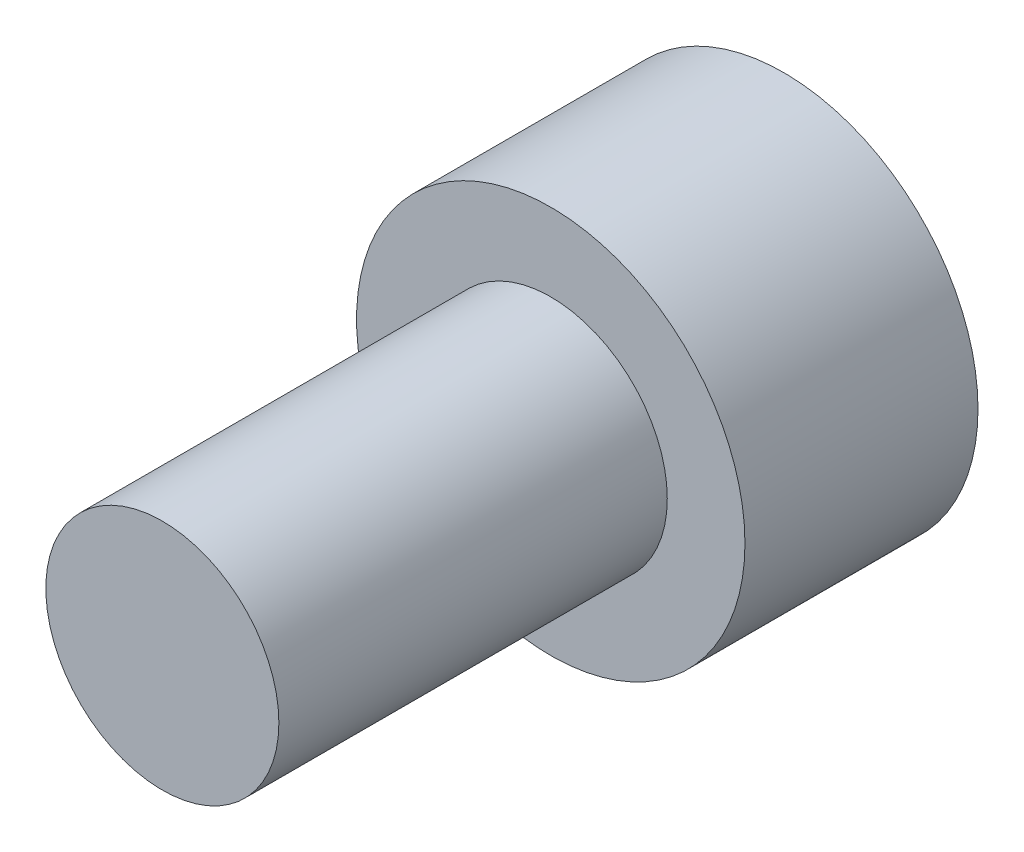
ISO-10303-21;
HEADER;
FILE_DESCRIPTION(('STEP AP214'),'2;1');
FILE_NAME('part.step','',(''),(''),'','','');
FILE_SCHEMA(('AUTOMOTIVE_DESIGN { 1 0 10303 214 1 1 1 1 }'));
ENDSEC;
DATA;
#1=APPLICATION_CONTEXT('core data for automotive mechanical design processes');
#2=APPLICATION_PROTOCOL_DEFINITION('international standard','automotive_design',2000,#1);
#3=PRODUCT_CONTEXT('',#1,'mechanical');
#4=PRODUCT('Part','Part','',(#3));
#5=PRODUCT_RELATED_PRODUCT_CATEGORY('part','',(#4));
#6=PRODUCT_DEFINITION_FORMATION('','',#4);
#7=PRODUCT_DEFINITION_CONTEXT('part definition',#1,'design');
#8=PRODUCT_DEFINITION('design','',#6,#7);
#9=PRODUCT_DEFINITION_SHAPE('','',#8);
#10=(LENGTH_UNIT() NAMED_UNIT(*) SI_UNIT(.MILLI.,.METRE.));
#11=(NAMED_UNIT(*) PLANE_ANGLE_UNIT() SI_UNIT($,.RADIAN.));
#12=(NAMED_UNIT(*) SI_UNIT($,.STERADIAN.) SOLID_ANGLE_UNIT());
#13=UNCERTAINTY_MEASURE_WITH_UNIT(LENGTH_MEASURE(1.E-05),#10,'distance_accuracy_value','');
#14=(GEOMETRIC_REPRESENTATION_CONTEXT(3) GLOBAL_UNCERTAINTY_ASSIGNED_CONTEXT((#13)) GLOBAL_UNIT_ASSIGNED_CONTEXT((#10,
#11,#12)) REPRESENTATION_CONTEXT('',''));
#15=CARTESIAN_POINT('',(0.,0.,0.));
#16=DIRECTION('',(0.,0.,1.));
#17=DIRECTION('',(1.,0.,0.));
#18=AXIS2_PLACEMENT_3D('',#15,#16,#17);
#19=CARTESIAN_POINT('',(0.,0.,6.));
#20=DIRECTION('',(0.,0.,1.));
#21=DIRECTION('',(1.,0.,0.));
#22=AXIS2_PLACEMENT_3D('',#19,#20,#21);
#23=PLANE('',#22);
#24=CARTESIAN_POINT('',(0.,0.,6.));
#25=DIRECTION('',(0.,0.,1.));
#26=DIRECTION('',(1.,0.,0.));
#27=AXIS2_PLACEMENT_3D('',#24,#25,#26);
#28=CIRCLE('',#27,5.);
#29=CARTESIAN_POINT('',(5.,0.,6.));
#30=VERTEX_POINT('',#29);
#31=EDGE_CURVE('E11',#30,#30,#28,.T.);
#32=ORIENTED_EDGE('',*,*,#31,.T.);
#33=EDGE_LOOP('',(#32));
#34=FACE_BOUND('',#33,.T.);
#35=CARTESIAN_POINT('',(0.,0.,6.));
#36=DIRECTION('',(0.,0.,1.));
#37=DIRECTION('',(1.,0.,0.));
#38=AXIS2_PLACEMENT_3D('',#35,#36,#37);
#39=CIRCLE('',#38,3.);
#40=CARTESIAN_POINT('',(3.,0.,6.));
#41=VERTEX_POINT('',#40);
#42=EDGE_CURVE('E139',#41,#41,#39,.T.);
#43=ORIENTED_EDGE('',*,*,#42,.F.);
#44=EDGE_LOOP('',(#43));
#45=FACE_BOUND('',#44,.T.);
#46=ADVANCED_FACE('F37',(#34,#45),#23,.T.);
#47=CARTESIAN_POINT('',(0.,0.,6.));
#48=DIRECTION('',(0.,0.,-1.));
#49=DIRECTION('',(-1.,0.,0.));
#50=AXIS2_PLACEMENT_3D('',#47,#48,#49);
#51=CYLINDRICAL_SURFACE('',#50,5.);
#52=ORIENTED_EDGE('',*,*,#31,.F.);
#53=EDGE_LOOP('',(#52));
#54=FACE_BOUND('',#53,.T.);
#55=CARTESIAN_POINT('',(0.,0.,0.));
#56=DIRECTION('',(0.,0.,1.));
#57=DIRECTION('',(1.,0.,0.));
#58=AXIS2_PLACEMENT_3D('',#55,#56,#57);
#59=CIRCLE('',#58,5.);
#60=CARTESIAN_POINT('',(5.,0.,0.));
#61=VERTEX_POINT('',#60);
#62=EDGE_CURVE('E41',#61,#61,#59,.T.);
#63=ORIENTED_EDGE('',*,*,#62,.T.);
#64=EDGE_LOOP('',(#63));
#65=FACE_BOUND('',#64,.T.);
#66=ADVANCED_FACE('F39',(#54,#65),#51,.T.);
#67=CARTESIAN_POINT('',(0.,0.,0.));
#68=DIRECTION('',(0.,0.,1.));
#69=DIRECTION('',(1.,0.,0.));
#70=AXIS2_PLACEMENT_3D('',#67,#68,#69);
#71=PLANE('',#70);
#72=DIRECTION('',(0.961310652096989,0.275466568143691,0.));
#73=VECTOR('',#72,1.);
#74=CARTESIAN_POINT('',(-2.44462819370027,2.36158950964695,0.));
#75=LINE('',#74,#73);
#76=CARTESIAN_POINT('',(-2.44462819370027,2.36158950964695,0.));
#77=VERTEX_POINT('',#76);
#78=CARTESIAN_POINT('',(0.822882411814956,3.29790487337557,0.));
#79=VERTEX_POINT('',#78);
#80=EDGE_CURVE('E126',#77,#79,#75,.T.);
#81=ORIENTED_EDGE('',*,*,#80,.F.);
#82=DIRECTION('',(0.242094280142741,0.970252729716422,0.));
#83=VECTOR('',#82,1.);
#84=CARTESIAN_POINT('',(-3.26751060551523,-0.936315363728624,0.));
#85=LINE('',#84,#83);
#86=CARTESIAN_POINT('',(-3.26751060551523,-0.936315363728624,0.));
#87=VERTEX_POINT('',#86);
#88=EDGE_CURVE('E52',#87,#77,#85,.T.);
#89=ORIENTED_EDGE('',*,*,#88,.F.);
#90=DIRECTION('',(-0.719216371954248,0.694786161572731,0.));
#91=VECTOR('',#90,1.);
#92=CARTESIAN_POINT('',(-0.822882411814958,-3.29790487337557,0.));
#93=LINE('',#92,#91);
#94=CARTESIAN_POINT('',(-0.822882411814958,-3.29790487337557,0.));
#95=VERTEX_POINT('',#94);
#96=EDGE_CURVE('E135',#95,#87,#93,.T.);
#97=ORIENTED_EDGE('',*,*,#96,.F.);
#98=DIRECTION('',(-0.961310652096989,-0.275466568143691,0.));
#99=VECTOR('',#98,1.);
#100=CARTESIAN_POINT('',(2.44462819370027,-2.36158950964695,0.));
#101=LINE('',#100,#99);
#102=CARTESIAN_POINT('',(2.44462819370027,-2.36158950964695,0.));
#103=VERTEX_POINT('',#102);
#104=EDGE_CURVE('E133',#103,#95,#101,.T.);
#105=ORIENTED_EDGE('',*,*,#104,.F.);
#106=DIRECTION('',(-0.242094280142741,-0.970252729716422,0.));
#107=VECTOR('',#106,1.);
#108=CARTESIAN_POINT('',(3.26751060551522,0.936315363728623,0.));
#109=LINE('',#108,#107);
#110=CARTESIAN_POINT('',(3.26751060551522,0.936315363728623,0.));
#111=VERTEX_POINT('',#110);
#112=EDGE_CURVE('E100',#111,#103,#109,.T.);
#113=ORIENTED_EDGE('',*,*,#112,.F.);
#114=DIRECTION('',(0.719216371954247,-0.694786161572731,0.));
#115=VECTOR('',#114,1.);
#116=CARTESIAN_POINT('',(0.822882411814956,3.29790487337557,0.));
#117=LINE('',#116,#115);
#118=EDGE_CURVE('E129',#79,#111,#117,.T.);
#119=ORIENTED_EDGE('',*,*,#118,.F.);
#120=EDGE_LOOP('',(#81,#89,#97,#105,#113,#119));
#121=FACE_BOUND('',#120,.T.);
#122=ORIENTED_EDGE('',*,*,#62,.F.);
#123=EDGE_LOOP('',(#122));
#124=FACE_BOUND('',#123,.T.);
#125=ADVANCED_FACE('F159',(#121,#124),#71,.F.);
#126=CARTESIAN_POINT('',(0.,0.,16.));
#127=DIRECTION('',(0.,0.,-1.));
#128=DIRECTION('',(-1.,0.,0.));
#129=AXIS2_PLACEMENT_3D('',#126,#127,#128);
#130=CYLINDRICAL_SURFACE('',#129,3.);
#131=CARTESIAN_POINT('',(0.,0.,16.));
#132=DIRECTION('',(0.,0.,1.));
#133=DIRECTION('',(1.,0.,0.));
#134=AXIS2_PLACEMENT_3D('',#131,#132,#133);
#135=CIRCLE('',#134,3.);
#136=CARTESIAN_POINT('',(3.,0.,16.));
#137=VERTEX_POINT('',#136);
#138=EDGE_CURVE('E145',#137,#137,#135,.T.);
#139=ORIENTED_EDGE('',*,*,#138,.F.);
#140=EDGE_LOOP('',(#139));
#141=FACE_BOUND('',#140,.T.);
#142=ORIENTED_EDGE('',*,*,#42,.T.);
#143=EDGE_LOOP('',(#142));
#144=FACE_BOUND('',#143,.T.);
#145=ADVANCED_FACE('F151',(#141,#144),#130,.T.);
#146=CARTESIAN_POINT('',(0.,0.,16.));
#147=DIRECTION('',(0.,0.,1.));
#148=DIRECTION('',(1.,0.,0.));
#149=AXIS2_PLACEMENT_3D('',#146,#147,#148);
#150=PLANE('',#149);
#151=ORIENTED_EDGE('',*,*,#138,.T.);
#152=EDGE_LOOP('',(#151));
#153=FACE_BOUND('',#152,.T.);
#154=ADVANCED_FACE('F168',(#153),#150,.T.);
#155=CARTESIAN_POINT('',(-3.26751060551523,-0.936315363728624,3.));
#156=DIRECTION('',(-0.970252729716422,0.242094280142741,0.));
#157=DIRECTION('',(-0.242094280142741,-0.970252729716422,0.));
#158=AXIS2_PLACEMENT_3D('',#155,#156,#157);
#159=PLANE('',#158);
#160=ORIENTED_EDGE('',*,*,#88,.T.);
#161=DIRECTION('',(0.,0.,-1.));
#162=VECTOR('',#161,1.);
#163=CARTESIAN_POINT('',(-2.44462819370027,2.36158950964695,3.));
#164=LINE('',#163,#162);
#165=CARTESIAN_POINT('',(-2.44462819370027,2.36158950964695,3.));
#166=VERTEX_POINT('',#165);
#167=EDGE_CURVE('E82',#166,#77,#164,.T.);
#168=ORIENTED_EDGE('',*,*,#167,.F.);
#169=DIRECTION('',(0.242094280142741,0.970252729716422,0.));
#170=VECTOR('',#169,1.);
#171=CARTESIAN_POINT('',(-3.26751060551523,-0.936315363728624,3.));
#172=LINE('',#171,#170);
#173=CARTESIAN_POINT('',(-3.26751060551523,-0.936315363728624,3.));
#174=VERTEX_POINT('',#173);
#175=EDGE_CURVE('E137',#174,#166,#172,.T.);
#176=ORIENTED_EDGE('',*,*,#175,.F.);
#177=DIRECTION('',(0.,0.,-1.));
#178=VECTOR('',#177,1.);
#179=CARTESIAN_POINT('',(-3.26751060551523,-0.936315363728624,3.));
#180=LINE('',#179,#178);
#181=EDGE_CURVE('E60',#174,#87,#180,.T.);
#182=ORIENTED_EDGE('',*,*,#181,.T.);
#183=EDGE_LOOP('',(#160,#168,#176,#182));
#184=FACE_BOUND('',#183,.T.);
#185=ADVANCED_FACE('F180',(#184),#159,.F.);
#186=CARTESIAN_POINT('',(-0.822882411814958,-3.29790487337557,3.));
#187=DIRECTION('',(-0.694786161572731,-0.719216371954248,0.));
#188=DIRECTION('',(0.719216371954248,-0.694786161572731,0.));
#189=AXIS2_PLACEMENT_3D('',#186,#187,#188);
#190=PLANE('',#189);
#191=ORIENTED_EDGE('',*,*,#96,.T.);
#192=ORIENTED_EDGE('',*,*,#181,.F.);
#193=DIRECTION('',(-0.719216371954248,0.694786161572731,0.));
#194=VECTOR('',#193,1.);
#195=CARTESIAN_POINT('',(-0.822882411814958,-3.29790487337557,3.));
#196=LINE('',#195,#194);
#197=CARTESIAN_POINT('',(-0.822882411814958,-3.29790487337557,3.));
#198=VERTEX_POINT('',#197);
#199=EDGE_CURVE('E112',#198,#174,#196,.T.);
#200=ORIENTED_EDGE('',*,*,#199,.F.);
#201=DIRECTION('',(0.,0.,-1.));
#202=VECTOR('',#201,1.);
#203=CARTESIAN_POINT('',(-0.822882411814958,-3.29790487337557,3.));
#204=LINE('',#203,#202);
#205=EDGE_CURVE('E104',#198,#95,#204,.T.);
#206=ORIENTED_EDGE('',*,*,#205,.T.);
#207=EDGE_LOOP('',(#191,#192,#200,#206));
#208=FACE_BOUND('',#207,.T.);
#209=ADVANCED_FACE('F182',(#208),#190,.F.);
#210=CARTESIAN_POINT('',(2.44462819370027,-2.36158950964695,3.));
#211=DIRECTION('',(0.275466568143691,-0.961310652096988,0.));
#212=DIRECTION('',(0.961310652096989,0.275466568143691,0.));
#213=AXIS2_PLACEMENT_3D('',#210,#211,#212);
#214=PLANE('',#213);
#215=ORIENTED_EDGE('',*,*,#104,.T.);
#216=ORIENTED_EDGE('',*,*,#205,.F.);
#217=DIRECTION('',(-0.961310652096989,-0.275466568143691,0.));
#218=VECTOR('',#217,1.);
#219=CARTESIAN_POINT('',(2.44462819370027,-2.36158950964695,3.));
#220=LINE('',#219,#218);
#221=CARTESIAN_POINT('',(2.44462819370027,-2.36158950964695,3.));
#222=VERTEX_POINT('',#221);
#223=EDGE_CURVE('E108',#222,#198,#220,.T.);
#224=ORIENTED_EDGE('',*,*,#223,.F.);
#225=DIRECTION('',(0.,0.,-1.));
#226=VECTOR('',#225,1.);
#227=CARTESIAN_POINT('',(2.44462819370027,-2.36158950964695,3.));
#228=LINE('',#227,#226);
#229=EDGE_CURVE('E93',#222,#103,#228,.T.);
#230=ORIENTED_EDGE('',*,*,#229,.T.);
#231=EDGE_LOOP('',(#215,#216,#224,#230));
#232=FACE_BOUND('',#231,.T.);
#233=ADVANCED_FACE('F109',(#232),#214,.F.);
#234=CARTESIAN_POINT('',(3.26751060551522,0.936315363728623,3.));
#235=DIRECTION('',(0.970252729716422,-0.242094280142741,0.));
#236=DIRECTION('',(0.242094280142741,0.970252729716422,0.));
#237=AXIS2_PLACEMENT_3D('',#234,#235,#236);
#238=PLANE('',#237);
#239=ORIENTED_EDGE('',*,*,#112,.T.);
#240=ORIENTED_EDGE('',*,*,#229,.F.);
#241=DIRECTION('',(-0.242094280142741,-0.970252729716422,0.));
#242=VECTOR('',#241,1.);
#243=CARTESIAN_POINT('',(3.26751060551522,0.936315363728623,3.));
#244=LINE('',#243,#242);
#245=CARTESIAN_POINT('',(3.26751060551522,0.936315363728623,3.));
#246=VERTEX_POINT('',#245);
#247=EDGE_CURVE('E97',#246,#222,#244,.T.);
#248=ORIENTED_EDGE('',*,*,#247,.F.);
#249=DIRECTION('',(0.,0.,-1.));
#250=VECTOR('',#249,1.);
#251=CARTESIAN_POINT('',(3.26751060551522,0.936315363728623,3.));
#252=LINE('',#251,#250);
#253=EDGE_CURVE('E105',#246,#111,#252,.T.);
#254=ORIENTED_EDGE('',*,*,#253,.T.);
#255=EDGE_LOOP('',(#239,#240,#248,#254));
#256=FACE_BOUND('',#255,.T.);
#257=ADVANCED_FACE('F95',(#256),#238,.F.);
#258=CARTESIAN_POINT('',(0.822882411814956,3.29790487337557,3.));
#259=DIRECTION('',(0.694786161572731,0.719216371954248,0.));
#260=DIRECTION('',(-0.719216371954248,0.694786161572731,0.));
#261=AXIS2_PLACEMENT_3D('',#258,#259,#260);
#262=PLANE('',#261);
#263=ORIENTED_EDGE('',*,*,#118,.T.);
#264=ORIENTED_EDGE('',*,*,#253,.F.);
#265=DIRECTION('',(0.719216371954247,-0.694786161572731,0.));
#266=VECTOR('',#265,1.);
#267=CARTESIAN_POINT('',(0.822882411814956,3.29790487337557,3.));
#268=LINE('',#267,#266);
#269=CARTESIAN_POINT('',(0.822882411814956,3.29790487337557,3.));
#270=VERTEX_POINT('',#269);
#271=EDGE_CURVE('E118',#270,#246,#268,.T.);
#272=ORIENTED_EDGE('',*,*,#271,.F.);
#273=DIRECTION('',(0.,0.,-1.));
#274=VECTOR('',#273,1.);
#275=CARTESIAN_POINT('',(0.822882411814956,3.29790487337557,3.));
#276=LINE('',#275,#274);
#277=EDGE_CURVE('E142',#270,#79,#276,.T.);
#278=ORIENTED_EDGE('',*,*,#277,.T.);
#279=EDGE_LOOP('',(#263,#264,#272,#278));
#280=FACE_BOUND('',#279,.T.);
#281=ADVANCED_FACE('F193',(#280),#262,.F.);
#282=CARTESIAN_POINT('',(-2.44462819370027,2.36158950964695,3.));
#283=DIRECTION('',(-0.275466568143691,0.961310652096988,0.));
#284=DIRECTION('',(-0.961310652096989,-0.275466568143691,0.));
#285=AXIS2_PLACEMENT_3D('',#282,#283,#284);
#286=PLANE('',#285);
#287=ORIENTED_EDGE('',*,*,#80,.T.);
#288=ORIENTED_EDGE('',*,*,#277,.F.);
#289=DIRECTION('',(0.961310652096989,0.275466568143691,0.));
#290=VECTOR('',#289,1.);
#291=CARTESIAN_POINT('',(-2.44462819370027,2.36158950964695,3.));
#292=LINE('',#291,#290);
#293=EDGE_CURVE('E120',#166,#270,#292,.T.);
#294=ORIENTED_EDGE('',*,*,#293,.F.);
#295=ORIENTED_EDGE('',*,*,#167,.T.);
#296=EDGE_LOOP('',(#287,#288,#294,#295));
#297=FACE_BOUND('',#296,.T.);
#298=ADVANCED_FACE('F178',(#297),#286,.F.);
#299=CARTESIAN_POINT('',(0.,0.,3.));
#300=DIRECTION('',(0.,0.,-1.));
#301=DIRECTION('',(-1.,0.,0.));
#302=AXIS2_PLACEMENT_3D('',#299,#300,#301);
#303=PLANE('',#302);
#304=ORIENTED_EDGE('',*,*,#175,.T.);
#305=ORIENTED_EDGE('',*,*,#293,.T.);
#306=ORIENTED_EDGE('',*,*,#271,.T.);
#307=ORIENTED_EDGE('',*,*,#247,.T.);
#308=ORIENTED_EDGE('',*,*,#223,.T.);
#309=ORIENTED_EDGE('',*,*,#199,.T.);
#310=EDGE_LOOP('',(#304,#305,#306,#307,#308,#309));
#311=FACE_BOUND('',#310,.T.);
#312=ADVANCED_FACE('F115',(#311),#303,.T.);
#313=CLOSED_SHELL('',(#46,#66,#125,#145,#154,#185,#209,#233,#257,#281,#298,#312));
#314=MANIFOLD_SOLID_BREP('B2',#313);
#315=ADVANCED_BREP_SHAPE_REPRESENTATION('',(#18,#314),#14);
#316=SHAPE_DEFINITION_REPRESENTATION(#9,#315);
ENDSEC;
END-ISO-10303-21;
